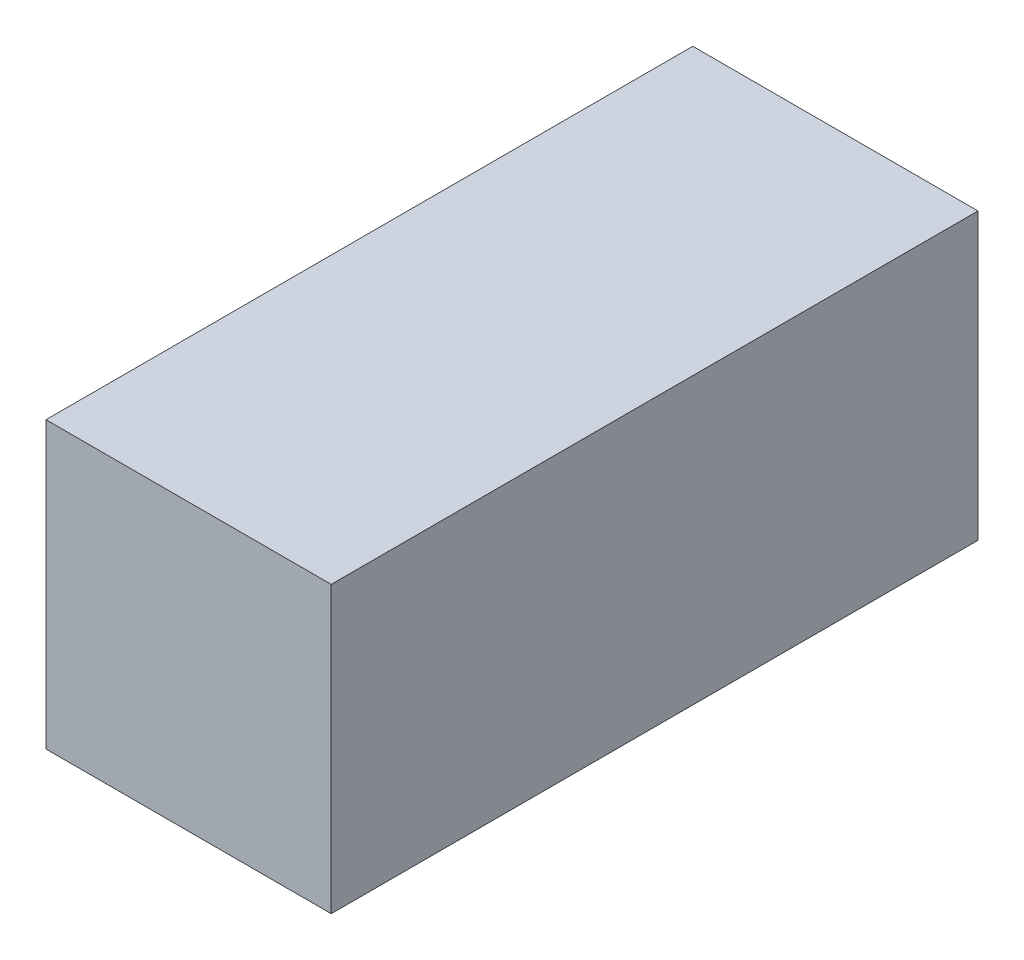
ISO-10303-21;
HEADER;
FILE_DESCRIPTION(('STEP AP214'),'2;1');
FILE_NAME('part.step','',(''),(''),'','','');
FILE_SCHEMA(('AUTOMOTIVE_DESIGN { 1 0 10303 214 1 1 1 1 }'));
ENDSEC;
DATA;
#1=APPLICATION_CONTEXT('core data for automotive mechanical design processes');
#2=APPLICATION_PROTOCOL_DEFINITION('international standard','automotive_design',2000,#1);
#3=PRODUCT_CONTEXT('',#1,'mechanical');
#4=PRODUCT('Part','Part','',(#3));
#5=PRODUCT_RELATED_PRODUCT_CATEGORY('part','',(#4));
#6=PRODUCT_DEFINITION_FORMATION('','',#4);
#7=PRODUCT_DEFINITION_CONTEXT('part definition',#1,'design');
#8=PRODUCT_DEFINITION('design','',#6,#7);
#9=PRODUCT_DEFINITION_SHAPE('','',#8);
#10=(LENGTH_UNIT() NAMED_UNIT(*) SI_UNIT(.MILLI.,.METRE.));
#11=(NAMED_UNIT(*) PLANE_ANGLE_UNIT() SI_UNIT($,.RADIAN.));
#12=(NAMED_UNIT(*) SI_UNIT($,.STERADIAN.) SOLID_ANGLE_UNIT());
#13=UNCERTAINTY_MEASURE_WITH_UNIT(LENGTH_MEASURE(1.E-05),#10,'distance_accuracy_value','');
#14=(GEOMETRIC_REPRESENTATION_CONTEXT(3) GLOBAL_UNCERTAINTY_ASSIGNED_CONTEXT((#13)) GLOBAL_UNIT_ASSIGNED_CONTEXT((#10,
#11,#12)) REPRESENTATION_CONTEXT('',''));
#15=CARTESIAN_POINT('',(0.,0.,0.));
#16=DIRECTION('',(0.,0.,1.));
#17=DIRECTION('',(1.,0.,0.));
#18=AXIS2_PLACEMENT_3D('',#15,#16,#17);
#19=CARTESIAN_POINT('',(0.,2.69,0.));
#20=DIRECTION('',(-1.,0.,0.));
#21=DIRECTION('',(0.,0.,1.));
#22=AXIS2_PLACEMENT_3D('',#19,#20,#21);
#23=PLANE('',#22);
#24=DIRECTION('',(0.,0.,-1.));
#25=VECTOR('',#24,1.);
#26=CARTESIAN_POINT('',(0.,0.,0.));
#27=LINE('',#26,#25);
#28=CARTESIAN_POINT('',(0.,0.,0.));
#29=VERTEX_POINT('',#28);
#30=CARTESIAN_POINT('',(0.,0.,-6.1));
#31=VERTEX_POINT('',#30);
#32=EDGE_CURVE('E107',#29,#31,#27,.T.);
#33=ORIENTED_EDGE('',*,*,#32,.T.);
#34=DIRECTION('',(0.,-1.,0.));
#35=VECTOR('',#34,1.);
#36=CARTESIAN_POINT('',(0.,2.69,-6.1));
#37=LINE('',#36,#35);
#38=CARTESIAN_POINT('',(0.,2.69,-6.1));
#39=VERTEX_POINT('',#38);
#40=EDGE_CURVE('E11',#39,#31,#37,.T.);
#41=ORIENTED_EDGE('',*,*,#40,.F.);
#42=DIRECTION('',(0.,0.,-1.));
#43=VECTOR('',#42,1.);
#44=CARTESIAN_POINT('',(0.,2.69,0.));
#45=LINE('',#44,#43);
#46=CARTESIAN_POINT('',(0.,2.69,0.));
#47=VERTEX_POINT('',#46);
#48=EDGE_CURVE('E91',#47,#39,#45,.T.);
#49=ORIENTED_EDGE('',*,*,#48,.F.);
#50=DIRECTION('',(0.,-1.,0.));
#51=VECTOR('',#50,1.);
#52=CARTESIAN_POINT('',(0.,2.69,0.));
#53=LINE('',#52,#51);
#54=EDGE_CURVE('E103',#47,#29,#53,.T.);
#55=ORIENTED_EDGE('',*,*,#54,.T.);
#56=EDGE_LOOP('',(#33,#41,#49,#55));
#57=FACE_BOUND('',#56,.T.);
#58=ADVANCED_FACE('F39',(#57),#23,.F.);
#59=CARTESIAN_POINT('',(0.,2.69,-6.1));
#60=DIRECTION('',(0.,0.,1.));
#61=DIRECTION('',(1.,0.,0.));
#62=AXIS2_PLACEMENT_3D('',#59,#60,#61);
#63=PLANE('',#62);
#64=DIRECTION('',(-1.,0.,0.));
#65=VECTOR('',#64,1.);
#66=CARTESIAN_POINT('',(0.,0.,-6.1));
#67=LINE('',#66,#65);
#68=CARTESIAN_POINT('',(-2.69,0.,-6.1));
#69=VERTEX_POINT('',#68);
#70=EDGE_CURVE('E96',#31,#69,#67,.T.);
#71=ORIENTED_EDGE('',*,*,#70,.T.);
#72=DIRECTION('',(0.,-1.,0.));
#73=VECTOR('',#72,1.);
#74=CARTESIAN_POINT('',(-2.69,2.69,-6.1));
#75=LINE('',#74,#73);
#76=CARTESIAN_POINT('',(-2.69,2.69,-6.1));
#77=VERTEX_POINT('',#76);
#78=EDGE_CURVE('E48',#77,#69,#75,.T.);
#79=ORIENTED_EDGE('',*,*,#78,.F.);
#80=DIRECTION('',(-1.,0.,0.));
#81=VECTOR('',#80,1.);
#82=CARTESIAN_POINT('',(0.,2.69,-6.1));
#83=LINE('',#82,#81);
#84=EDGE_CURVE('E86',#39,#77,#83,.T.);
#85=ORIENTED_EDGE('',*,*,#84,.F.);
#86=ORIENTED_EDGE('',*,*,#40,.T.);
#87=EDGE_LOOP('',(#71,#79,#85,#86));
#88=FACE_BOUND('',#87,.T.);
#89=ADVANCED_FACE('F95',(#88),#63,.F.);
#90=CARTESIAN_POINT('',(-2.69,2.69,0.));
#91=DIRECTION('',(1.,0.,0.));
#92=DIRECTION('',(0.,0.,-1.));
#93=AXIS2_PLACEMENT_3D('',#90,#91,#92);
#94=PLANE('',#93);
#95=DIRECTION('',(0.,0.,1.));
#96=VECTOR('',#95,1.);
#97=CARTESIAN_POINT('',(-2.69,0.,0.));
#98=LINE('',#97,#96);
#99=CARTESIAN_POINT('',(-2.69,0.,0.));
#100=VERTEX_POINT('',#99);
#101=EDGE_CURVE('E73',#69,#100,#98,.T.);
#102=ORIENTED_EDGE('',*,*,#101,.T.);
#103=DIRECTION('',(0.,-1.,0.));
#104=VECTOR('',#103,1.);
#105=CARTESIAN_POINT('',(-2.69,2.69,0.));
#106=LINE('',#105,#104);
#107=CARTESIAN_POINT('',(-2.69,2.69,0.));
#108=VERTEX_POINT('',#107);
#109=EDGE_CURVE('E98',#108,#100,#106,.T.);
#110=ORIENTED_EDGE('',*,*,#109,.F.);
#111=DIRECTION('',(0.,0.,1.));
#112=VECTOR('',#111,1.);
#113=CARTESIAN_POINT('',(-2.69,2.69,0.));
#114=LINE('',#113,#112);
#115=EDGE_CURVE('E89',#77,#108,#114,.T.);
#116=ORIENTED_EDGE('',*,*,#115,.F.);
#117=ORIENTED_EDGE('',*,*,#78,.T.);
#118=EDGE_LOOP('',(#102,#110,#116,#117));
#119=FACE_BOUND('',#118,.T.);
#120=ADVANCED_FACE('F99',(#119),#94,.F.);
#121=CARTESIAN_POINT('',(0.,2.69,0.));
#122=DIRECTION('',(0.,0.,-1.));
#123=DIRECTION('',(-1.,0.,0.));
#124=AXIS2_PLACEMENT_3D('',#121,#122,#123);
#125=PLANE('',#124);
#126=DIRECTION('',(1.,0.,0.));
#127=VECTOR('',#126,1.);
#128=CARTESIAN_POINT('',(0.,0.,0.));
#129=LINE('',#128,#127);
#130=EDGE_CURVE('E79',#100,#29,#129,.T.);
#131=ORIENTED_EDGE('',*,*,#130,.T.);
#132=ORIENTED_EDGE('',*,*,#54,.F.);
#133=DIRECTION('',(1.,0.,0.));
#134=VECTOR('',#133,1.);
#135=CARTESIAN_POINT('',(0.,2.69,0.));
#136=LINE('',#135,#134);
#137=EDGE_CURVE('E56',#108,#47,#136,.T.);
#138=ORIENTED_EDGE('',*,*,#137,.F.);
#139=ORIENTED_EDGE('',*,*,#109,.T.);
#140=EDGE_LOOP('',(#131,#132,#138,#139));
#141=FACE_BOUND('',#140,.T.);
#142=ADVANCED_FACE('F120',(#141),#125,.F.);
#143=CARTESIAN_POINT('',(0.,2.69,0.));
#144=DIRECTION('',(0.,1.,0.));
#145=DIRECTION('',(0.,0.,1.));
#146=AXIS2_PLACEMENT_3D('',#143,#144,#145);
#147=PLANE('',#146);
#148=ORIENTED_EDGE('',*,*,#48,.T.);
#149=ORIENTED_EDGE('',*,*,#84,.T.);
#150=ORIENTED_EDGE('',*,*,#115,.T.);
#151=ORIENTED_EDGE('',*,*,#137,.T.);
#152=EDGE_LOOP('',(#148,#149,#150,#151));
#153=FACE_BOUND('',#152,.T.);
#154=ADVANCED_FACE('F87',(#153),#147,.T.);
#155=CARTESIAN_POINT('',(0.,0.,0.));
#156=DIRECTION('',(0.,1.,0.));
#157=DIRECTION('',(0.,0.,1.));
#158=AXIS2_PLACEMENT_3D('',#155,#156,#157);
#159=PLANE('',#158);
#160=ORIENTED_EDGE('',*,*,#32,.F.);
#161=ORIENTED_EDGE('',*,*,#130,.F.);
#162=ORIENTED_EDGE('',*,*,#101,.F.);
#163=ORIENTED_EDGE('',*,*,#70,.F.);
#164=EDGE_LOOP('',(#160,#161,#162,#163));
#165=FACE_BOUND('',#164,.T.);
#166=ADVANCED_FACE('F123',(#165),#159,.F.);
#167=CLOSED_SHELL('',(#58,#89,#120,#142,#154,#166));
#168=MANIFOLD_SOLID_BREP('B2',#167);
#169=ADVANCED_BREP_SHAPE_REPRESENTATION('',(#18,#168),#14);
#170=SHAPE_DEFINITION_REPRESENTATION(#9,#169);
ENDSEC;
END-ISO-10303-21;
